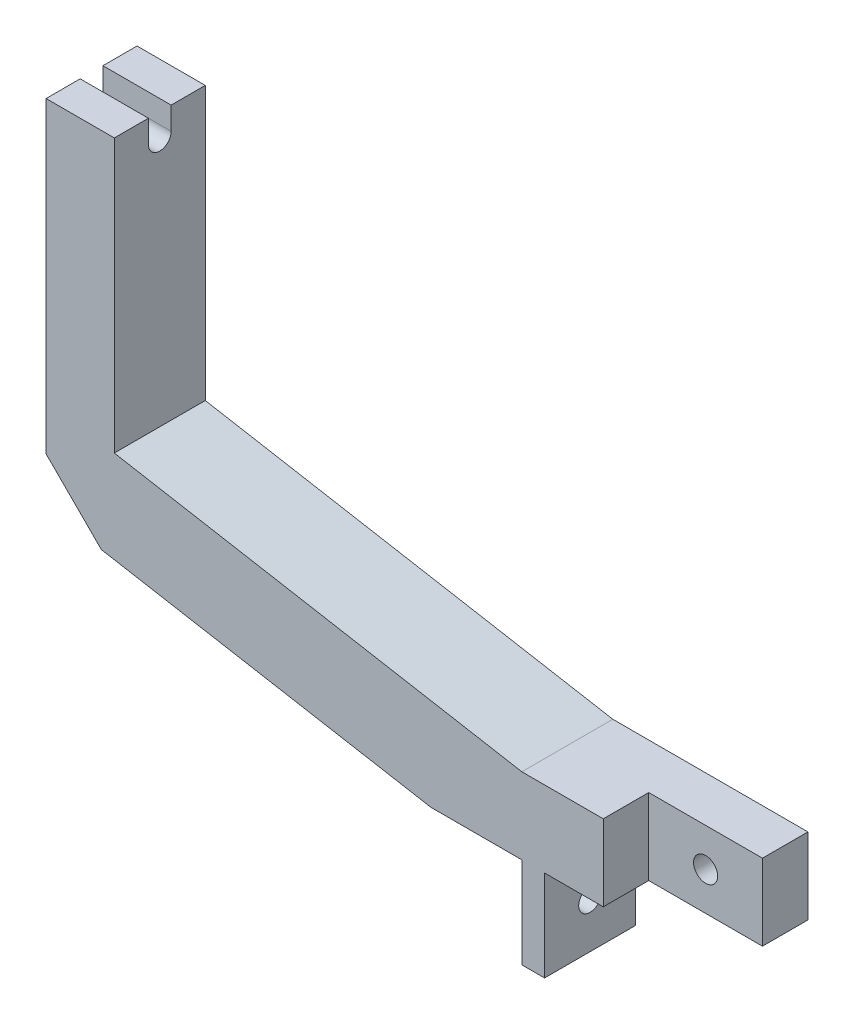
ISO-10303-21;
HEADER;
FILE_DESCRIPTION(('STEP AP214'),'2;1');
FILE_NAME('part.step','',(''),(''),'','','');
FILE_SCHEMA(('AUTOMOTIVE_DESIGN { 1 0 10303 214 1 1 1 1 }'));
ENDSEC;
DATA;
#1=APPLICATION_CONTEXT('core data for automotive mechanical design processes');
#2=APPLICATION_PROTOCOL_DEFINITION('international standard','automotive_design',2000,#1);
#3=PRODUCT_CONTEXT('',#1,'mechanical');
#4=PRODUCT('Part','Part','',(#3));
#5=PRODUCT_RELATED_PRODUCT_CATEGORY('part','',(#4));
#6=PRODUCT_DEFINITION_FORMATION('','',#4);
#7=PRODUCT_DEFINITION_CONTEXT('part definition',#1,'design');
#8=PRODUCT_DEFINITION('design','',#6,#7);
#9=PRODUCT_DEFINITION_SHAPE('','',#8);
#10=(LENGTH_UNIT() NAMED_UNIT(*) SI_UNIT(.MILLI.,.METRE.));
#11=(NAMED_UNIT(*) PLANE_ANGLE_UNIT() SI_UNIT($,.RADIAN.));
#12=(NAMED_UNIT(*) SI_UNIT($,.STERADIAN.) SOLID_ANGLE_UNIT());
#13=UNCERTAINTY_MEASURE_WITH_UNIT(LENGTH_MEASURE(1.E-05),#10,'distance_accuracy_value','');
#14=(GEOMETRIC_REPRESENTATION_CONTEXT(3) GLOBAL_UNCERTAINTY_ASSIGNED_CONTEXT((#13)) GLOBAL_UNIT_ASSIGNED_CONTEXT((#10,
#11,#12)) REPRESENTATION_CONTEXT('',''));
#15=CARTESIAN_POINT('',(0.,0.,0.));
#16=DIRECTION('',(0.,0.,1.));
#17=DIRECTION('',(1.,0.,0.));
#18=AXIS2_PLACEMENT_3D('',#15,#16,#17);
#19=CARTESIAN_POINT('',(-171.45,117.668501524975,25.4));
#20=DIRECTION('',(0.,-1.,0.));
#21=DIRECTION('',(0.,0.,-1.));
#22=AXIS2_PLACEMENT_3D('',#19,#20,#21);
#23=PLANE('',#22);
#24=DIRECTION('',(1.,0.,0.));
#25=VECTOR('',#24,1.);
#26=CARTESIAN_POINT('',(-171.45,117.668501524975,15.875));
#27=LINE('',#26,#25);
#28=CARTESIAN_POINT('',(-171.45,117.668501524975,15.875));
#29=VERTEX_POINT('',#28);
#30=CARTESIAN_POINT('',(-152.4,117.668501524975,15.875));
#31=VERTEX_POINT('',#30);
#32=EDGE_CURVE('E243',#29,#31,#27,.T.);
#33=ORIENTED_EDGE('',*,*,#32,.F.);
#34=DIRECTION('',(0.,0.,-1.));
#35=VECTOR('',#34,1.);
#36=CARTESIAN_POINT('',(-171.45,117.668501524975,25.4));
#37=LINE('',#36,#35);
#38=CARTESIAN_POINT('',(-171.45,117.668501524975,25.4));
#39=VERTEX_POINT('',#38);
#40=EDGE_CURVE('E346',#39,#29,#37,.T.);
#41=ORIENTED_EDGE('',*,*,#40,.F.);
#42=DIRECTION('',(-1.,0.,0.));
#43=VECTOR('',#42,1.);
#44=CARTESIAN_POINT('',(-171.45,117.668501524975,25.4));
#45=LINE('',#44,#43);
#46=CARTESIAN_POINT('',(-152.4,117.668501524975,25.4));
#47=VERTEX_POINT('',#46);
#48=EDGE_CURVE('E287',#47,#39,#45,.T.);
#49=ORIENTED_EDGE('',*,*,#48,.F.);
#50=DIRECTION('',(0.,0.,-1.));
#51=VECTOR('',#50,1.);
#52=CARTESIAN_POINT('',(-152.4,117.668501524975,25.4));
#53=LINE('',#52,#51);
#54=EDGE_CURVE('E355',#47,#31,#53,.T.);
#55=ORIENTED_EDGE('',*,*,#54,.T.);
#56=EDGE_LOOP('',(#33,#41,#49,#55));
#57=FACE_BOUND('',#56,.T.);
#58=ADVANCED_FACE('F50',(#57),#23,.F.);
#59=CARTESIAN_POINT('',(-152.4,117.668501524975,25.4));
#60=DIRECTION('',(-1.,0.,0.));
#61=DIRECTION('',(0.,0.,1.));
#62=AXIS2_PLACEMENT_3D('',#59,#60,#61);
#63=PLANE('',#62);
#64=DIRECTION('',(0.,1.,0.));
#65=VECTOR('',#64,1.);
#66=CARTESIAN_POINT('',(-152.4,117.668501524975,9.525));
#67=LINE('',#66,#65);
#68=CARTESIAN_POINT('',(-152.4,111.318501524975,9.525));
#69=VERTEX_POINT('',#68);
#70=CARTESIAN_POINT('',(-152.4,117.668501524975,9.525));
#71=VERTEX_POINT('',#70);
#72=EDGE_CURVE('E265',#69,#71,#67,.T.);
#73=ORIENTED_EDGE('',*,*,#72,.F.);
#74=CARTESIAN_POINT('',(-152.4,111.318501524975,12.7));
#75=DIRECTION('',(-1.,0.,0.));
#76=DIRECTION('',(0.,0.,1.));
#77=AXIS2_PLACEMENT_3D('',#74,#75,#76);
#78=CIRCLE('',#77,3.175);
#79=CARTESIAN_POINT('',(-152.4,111.318501524975,15.875));
#80=VERTEX_POINT('',#79);
#81=EDGE_CURVE('E259',#80,#69,#78,.F.);
#82=ORIENTED_EDGE('',*,*,#81,.F.);
#83=DIRECTION('',(0.,1.,0.));
#84=VECTOR('',#83,1.);
#85=CARTESIAN_POINT('',(-152.4,117.668501524975,15.875));
#86=LINE('',#85,#84);
#87=EDGE_CURVE('E240',#80,#31,#86,.T.);
#88=ORIENTED_EDGE('',*,*,#87,.T.);
#89=ORIENTED_EDGE('',*,*,#54,.F.);
#90=DIRECTION('',(0.,1.,0.));
#91=VECTOR('',#90,1.);
#92=CARTESIAN_POINT('',(-152.4,117.668501524975,25.4));
#93=LINE('',#92,#91);
#94=CARTESIAN_POINT('',(-152.4,41.4685015249753,25.4));
#95=VERTEX_POINT('',#94);
#96=EDGE_CURVE('E283',#95,#47,#93,.T.);
#97=ORIENTED_EDGE('',*,*,#96,.F.);
#98=DIRECTION('',(0.,0.,-1.));
#99=VECTOR('',#98,1.);
#100=CARTESIAN_POINT('',(-152.4,41.4685015249753,25.4));
#101=LINE('',#100,#99);
#102=CARTESIAN_POINT('',(-152.4,41.4685015249753,0.));
#103=VERTEX_POINT('',#102);
#104=EDGE_CURVE('E357',#95,#103,#101,.T.);
#105=ORIENTED_EDGE('',*,*,#104,.T.);
#106=DIRECTION('',(0.,1.,0.));
#107=VECTOR('',#106,1.);
#108=CARTESIAN_POINT('',(-152.4,117.668501524975,0.));
#109=LINE('',#108,#107);
#110=CARTESIAN_POINT('',(-152.4,117.668501524975,0.));
#111=VERTEX_POINT('',#110);
#112=EDGE_CURVE('E320',#103,#111,#109,.T.);
#113=ORIENTED_EDGE('',*,*,#112,.T.);
#114=EDGE_CURVE('E351',#71,#111,#53,.T.);
#115=ORIENTED_EDGE('',*,*,#114,.F.);
#116=EDGE_LOOP('',(#73,#82,#88,#89,#97,#105,#113,#115));
#117=FACE_BOUND('',#116,.T.);
#118=ADVANCED_FACE('F412',(#117),#63,.F.);
#119=CARTESIAN_POINT('',(-171.45,19.05,25.4));
#120=DIRECTION('',(1.,0.,0.));
#121=DIRECTION('',(0.,1.,0.));
#122=AXIS2_PLACEMENT_3D('',#119,#120,#121);
#123=PLANE('',#122);
#124=DIRECTION('',(0.,-1.,0.));
#125=VECTOR('',#124,1.);
#126=CARTESIAN_POINT('',(-171.45,19.05,0.));
#127=LINE('',#126,#125);
#128=CARTESIAN_POINT('',(-171.45,117.668501524975,0.));
#129=VERTEX_POINT('',#128);
#130=CARTESIAN_POINT('',(-171.45,31.7500000000001,0.));
#131=VERTEX_POINT('',#130);
#132=EDGE_CURVE('E324',#129,#131,#127,.T.);
#133=ORIENTED_EDGE('',*,*,#132,.T.);
#134=DIRECTION('',(0.,0.,1.));
#135=VECTOR('',#134,1.);
#136=CARTESIAN_POINT('',(-171.45,31.7500000000001,25.4));
#137=LINE('',#136,#135);
#138=CARTESIAN_POINT('',(-171.45,31.7500000000001,25.4));
#139=VERTEX_POINT('',#138);
#140=EDGE_CURVE('E71',#131,#139,#137,.T.);
#141=ORIENTED_EDGE('',*,*,#140,.T.);
#142=DIRECTION('',(0.,-1.,0.));
#143=VECTOR('',#142,1.);
#144=CARTESIAN_POINT('',(-171.45,19.05,25.4));
#145=LINE('',#144,#143);
#146=EDGE_CURVE('E290',#39,#139,#145,.T.);
#147=ORIENTED_EDGE('',*,*,#146,.F.);
#148=ORIENTED_EDGE('',*,*,#40,.T.);
#149=DIRECTION('',(0.,-1.,0.));
#150=VECTOR('',#149,1.);
#151=CARTESIAN_POINT('',(-171.45,117.668501524975,15.875));
#152=LINE('',#151,#150);
#153=CARTESIAN_POINT('',(-171.45,111.318501524975,15.875));
#154=VERTEX_POINT('',#153);
#155=EDGE_CURVE('E230',#29,#154,#152,.T.);
#156=ORIENTED_EDGE('',*,*,#155,.T.);
#157=CARTESIAN_POINT('',(-171.45,111.318501524975,12.7));
#158=DIRECTION('',(-1.,0.,0.));
#159=DIRECTION('',(0.,-1.,0.));
#160=AXIS2_PLACEMENT_3D('',#157,#158,#159);
#161=CIRCLE('',#160,3.175);
#162=CARTESIAN_POINT('',(-171.45,111.318501524975,9.525));
#163=VERTEX_POINT('',#162);
#164=EDGE_CURVE('E223',#163,#154,#161,.T.);
#165=ORIENTED_EDGE('',*,*,#164,.F.);
#166=DIRECTION('',(0.,-1.,0.));
#167=VECTOR('',#166,1.);
#168=CARTESIAN_POINT('',(-171.45,117.668501524975,9.525));
#169=LINE('',#168,#167);
#170=CARTESIAN_POINT('',(-171.45,117.668501524975,9.525));
#171=VERTEX_POINT('',#170);
#172=EDGE_CURVE('E222',#171,#163,#169,.T.);
#173=ORIENTED_EDGE('',*,*,#172,.F.);
#174=EDGE_CURVE('E350',#171,#129,#37,.T.);
#175=ORIENTED_EDGE('',*,*,#174,.T.);
#176=EDGE_LOOP('',(#133,#141,#147,#148,#156,#165,#173,#175));
#177=FACE_BOUND('',#176,.T.);
#178=ADVANCED_FACE('F418',(#177),#123,.F.);
#179=CARTESIAN_POINT('',(-32.258,-25.4,25.4));
#180=DIRECTION('',(0.,1.,0.));
#181=DIRECTION('',(0.,0.,1.));
#182=AXIS2_PLACEMENT_3D('',#179,#180,#181);
#183=PLANE('',#182);
#184=DIRECTION('',(1.,0.,0.));
#185=VECTOR('',#184,1.);
#186=CARTESIAN_POINT('',(-32.258,-25.4,0.));
#187=LINE('',#186,#185);
#188=CARTESIAN_POINT('',(-38.608,-25.4,0.));
#189=VERTEX_POINT('',#188);
#190=CARTESIAN_POINT('',(-32.258,-25.4,0.));
#191=VERTEX_POINT('',#190);
#192=EDGE_CURVE('E264',#189,#191,#187,.T.);
#193=ORIENTED_EDGE('',*,*,#192,.T.);
#194=DIRECTION('',(0.,0.,-1.));
#195=VECTOR('',#194,1.);
#196=CARTESIAN_POINT('',(-32.258,-25.4,25.4));
#197=LINE('',#196,#195);
#198=CARTESIAN_POINT('',(-32.258,-25.4,25.4));
#199=VERTEX_POINT('',#198);
#200=EDGE_CURVE('E366',#199,#191,#197,.T.);
#201=ORIENTED_EDGE('',*,*,#200,.F.);
#202=DIRECTION('',(1.,0.,0.));
#203=VECTOR('',#202,1.);
#204=CARTESIAN_POINT('',(-32.258,-25.4,25.4));
#205=LINE('',#204,#203);
#206=CARTESIAN_POINT('',(-38.608,-25.4,25.4));
#207=VERTEX_POINT('',#206);
#208=EDGE_CURVE('E266',#207,#199,#205,.T.);
#209=ORIENTED_EDGE('',*,*,#208,.F.);
#210=DIRECTION('',(0.,0.,-1.));
#211=VECTOR('',#210,1.);
#212=CARTESIAN_POINT('',(-38.608,-25.4,25.4));
#213=LINE('',#212,#211);
#214=EDGE_CURVE('E302',#207,#189,#213,.T.);
#215=ORIENTED_EDGE('',*,*,#214,.T.);
#216=EDGE_LOOP('',(#193,#201,#209,#215));
#217=FACE_BOUND('',#216,.T.);
#218=ADVANCED_FACE('F444',(#217),#183,.F.);
#219=CARTESIAN_POINT('',(-32.258,0.,25.4));
#220=DIRECTION('',(-1.,0.,0.));
#221=DIRECTION('',(0.,0.,1.));
#222=AXIS2_PLACEMENT_3D('',#219,#220,#221);
#223=PLANE('',#222);
#224=CARTESIAN_POINT('',(-32.258,-12.7,12.7));
#225=DIRECTION('',(-1.,0.,0.));
#226=DIRECTION('',(0.,0.,1.));
#227=AXIS2_PLACEMENT_3D('',#224,#225,#226);
#228=CIRCLE('',#227,3.175);
#229=CARTESIAN_POINT('',(-32.258,-12.7,15.875));
#230=VERTEX_POINT('',#229);
#231=EDGE_CURVE('E220',#230,#230,#228,.T.);
#232=ORIENTED_EDGE('',*,*,#231,.T.);
#233=EDGE_LOOP('',(#232));
#234=FACE_BOUND('',#233,.T.);
#235=DIRECTION('',(0.,1.,0.));
#236=VECTOR('',#235,1.);
#237=CARTESIAN_POINT('',(-32.258,0.,0.));
#238=LINE('',#237,#236);
#239=CARTESIAN_POINT('',(-32.258,0.,0.));
#240=VERTEX_POINT('',#239);
#241=EDGE_CURVE('E308',#191,#240,#238,.T.);
#242=ORIENTED_EDGE('',*,*,#241,.T.);
#243=DIRECTION('',(0.,0.,-1.));
#244=VECTOR('',#243,1.);
#245=CARTESIAN_POINT('',(-32.258,0.,25.4));
#246=LINE('',#245,#244);
#247=CARTESIAN_POINT('',(-32.258,0.,25.4));
#248=VERTEX_POINT('',#247);
#249=EDGE_CURVE('E364',#248,#240,#246,.T.);
#250=ORIENTED_EDGE('',*,*,#249,.F.);
#251=DIRECTION('',(0.,1.,0.));
#252=VECTOR('',#251,1.);
#253=CARTESIAN_POINT('',(-32.258,0.,25.4));
#254=LINE('',#253,#252);
#255=EDGE_CURVE('E269',#199,#248,#254,.T.);
#256=ORIENTED_EDGE('',*,*,#255,.F.);
#257=ORIENTED_EDGE('',*,*,#200,.T.);
#258=EDGE_LOOP('',(#242,#250,#256,#257));
#259=FACE_BOUND('',#258,.T.);
#260=ADVANCED_FACE('F443',(#234,#259),#223,.F.);
#261=CARTESIAN_POINT('',(32.258,0.,25.4));
#262=DIRECTION('',(0.,1.,0.));
#263=DIRECTION('',(0.,0.,1.));
#264=AXIS2_PLACEMENT_3D('',#261,#262,#263);
#265=PLANE('',#264);
#266=DIRECTION('',(-1.,0.,0.));
#267=VECTOR('',#266,1.);
#268=CARTESIAN_POINT('',(32.258,0.,12.7));
#269=LINE('',#268,#267);
#270=CARTESIAN_POINT('',(15.875,0.,12.7));
#271=VERTEX_POINT('',#270);
#272=CARTESIAN_POINT('',(-15.875,0.,12.7));
#273=VERTEX_POINT('',#272);
#274=EDGE_CURVE('E183',#271,#273,#269,.T.);
#275=ORIENTED_EDGE('',*,*,#274,.T.);
#276=DIRECTION('',(0.,0.,1.));
#277=VECTOR('',#276,1.);
#278=CARTESIAN_POINT('',(-15.875,0.,25.4));
#279=LINE('',#278,#277);
#280=CARTESIAN_POINT('',(-15.875,0.,25.4));
#281=VERTEX_POINT('',#280);
#282=EDGE_CURVE('E193',#273,#281,#279,.T.);
#283=ORIENTED_EDGE('',*,*,#282,.T.);
#284=DIRECTION('',(1.,0.,0.));
#285=VECTOR('',#284,1.);
#286=CARTESIAN_POINT('',(32.258,0.,25.4));
#287=LINE('',#286,#285);
#288=EDGE_CURVE('E273',#248,#281,#287,.T.);
#289=ORIENTED_EDGE('',*,*,#288,.F.);
#290=ORIENTED_EDGE('',*,*,#249,.T.);
#291=DIRECTION('',(1.,0.,0.));
#292=VECTOR('',#291,1.);
#293=CARTESIAN_POINT('',(32.258,0.,0.));
#294=LINE('',#293,#292);
#295=CARTESIAN_POINT('',(15.875,0.,0.));
#296=VERTEX_POINT('',#295);
#297=EDGE_CURVE('E202',#240,#296,#294,.T.);
#298=ORIENTED_EDGE('',*,*,#297,.T.);
#299=DIRECTION('',(0.,0.,1.));
#300=VECTOR('',#299,1.);
#301=CARTESIAN_POINT('',(15.875,0.,25.4));
#302=LINE('',#301,#300);
#303=EDGE_CURVE('E62',#296,#271,#302,.T.);
#304=ORIENTED_EDGE('',*,*,#303,.T.);
#305=EDGE_LOOP('',(#275,#283,#289,#290,#298,#304));
#306=FACE_BOUND('',#305,.T.);
#307=ADVANCED_FACE('F205',(#306),#265,.F.);
#308=CARTESIAN_POINT('',(-38.608,21.2926150001526,25.4));
#309=DIRECTION('',(0.,-1.,0.));
#310=DIRECTION('',(0.,0.,-1.));
#311=AXIS2_PLACEMENT_3D('',#308,#309,#310);
#312=PLANE('',#311);
#313=DIRECTION('',(-1.,0.,0.));
#314=VECTOR('',#313,1.);
#315=CARTESIAN_POINT('',(-38.608,21.2926150001526,25.4));
#316=LINE('',#315,#314);
#317=CARTESIAN_POINT('',(-15.875,21.2926150001526,25.4));
#318=VERTEX_POINT('',#317);
#319=CARTESIAN_POINT('',(-38.608,21.2926150001526,25.4));
#320=VERTEX_POINT('',#319);
#321=EDGE_CURVE('E279',#318,#320,#316,.T.);
#322=ORIENTED_EDGE('',*,*,#321,.F.);
#323=DIRECTION('',(0.,0.,-1.));
#324=VECTOR('',#323,1.);
#325=CARTESIAN_POINT('',(-15.875,21.2926150001526,25.4));
#326=LINE('',#325,#324);
#327=CARTESIAN_POINT('',(-15.875,21.2926150001526,12.7));
#328=VERTEX_POINT('',#327);
#329=EDGE_CURVE('E210',#318,#328,#326,.T.);
#330=ORIENTED_EDGE('',*,*,#329,.T.);
#331=DIRECTION('',(1.,0.,0.));
#332=VECTOR('',#331,1.);
#333=CARTESIAN_POINT('',(-38.608,21.2926150001526,12.7));
#334=LINE('',#333,#332);
#335=CARTESIAN_POINT('',(15.875,21.2926150001526,12.7));
#336=VERTEX_POINT('',#335);
#337=EDGE_CURVE('E11',#328,#336,#334,.T.);
#338=ORIENTED_EDGE('',*,*,#337,.T.);
#339=DIRECTION('',(0.,0.,-1.));
#340=VECTOR('',#339,1.);
#341=CARTESIAN_POINT('',(15.875,21.2926150001526,25.4));
#342=LINE('',#341,#340);
#343=CARTESIAN_POINT('',(15.875,21.2926150001526,0.));
#344=VERTEX_POINT('',#343);
#345=EDGE_CURVE('E196',#336,#344,#342,.T.);
#346=ORIENTED_EDGE('',*,*,#345,.T.);
#347=DIRECTION('',(-1.,0.,0.));
#348=VECTOR('',#347,1.);
#349=CARTESIAN_POINT('',(-38.608,21.2926150001526,0.));
#350=LINE('',#349,#348);
#351=CARTESIAN_POINT('',(-38.608,21.2926150001526,0.));
#352=VERTEX_POINT('',#351);
#353=EDGE_CURVE('E313',#344,#352,#350,.T.);
#354=ORIENTED_EDGE('',*,*,#353,.T.);
#355=DIRECTION('',(0.,0.,-1.));
#356=VECTOR('',#355,1.);
#357=CARTESIAN_POINT('',(-38.608,21.2926150001526,25.4));
#358=LINE('',#357,#356);
#359=EDGE_CURVE('E363',#320,#352,#358,.T.);
#360=ORIENTED_EDGE('',*,*,#359,.F.);
#361=EDGE_LOOP('',(#322,#330,#338,#346,#354,#360));
#362=FACE_BOUND('',#361,.T.);
#363=ADVANCED_FACE('F398',(#362),#312,.F.);
#364=CARTESIAN_POINT('',(-152.4,41.4685015249753,25.4));
#365=DIRECTION('',(-0.17458202722218,-0.984642633533098,0.));
#366=DIRECTION('',(0.984642633533098,-0.17458202722218,0.));
#367=AXIS2_PLACEMENT_3D('',#364,#365,#366);
#368=PLANE('',#367);
#369=DIRECTION('',(-0.984642633533098,0.17458202722218,0.));
#370=VECTOR('',#369,1.);
#371=CARTESIAN_POINT('',(-152.4,41.4685015249753,0.));
#372=LINE('',#371,#370);
#373=EDGE_CURVE('E314',#352,#103,#372,.T.);
#374=ORIENTED_EDGE('',*,*,#373,.T.);
#375=ORIENTED_EDGE('',*,*,#104,.F.);
#376=DIRECTION('',(-0.984642633533098,0.17458202722218,0.));
#377=VECTOR('',#376,1.);
#378=CARTESIAN_POINT('',(-152.4,41.4685015249753,25.4));
#379=LINE('',#378,#377);
#380=EDGE_CURVE('E284',#320,#95,#379,.T.);
#381=ORIENTED_EDGE('',*,*,#380,.F.);
#382=ORIENTED_EDGE('',*,*,#359,.T.);
#383=EDGE_LOOP('',(#374,#375,#381,#382));
#384=FACE_BOUND('',#383,.T.);
#385=ADVANCED_FACE('F403',(#384),#368,.F.);
#386=ORIENTED_EDGE('',*,*,#174,.F.);
#387=DIRECTION('',(1.,0.,0.));
#388=VECTOR('',#387,1.);
#389=CARTESIAN_POINT('',(-171.45,117.668501524975,9.525));
#390=LINE('',#389,#388);
#391=EDGE_CURVE('E232',#171,#71,#390,.T.);
#392=ORIENTED_EDGE('',*,*,#391,.T.);
#393=ORIENTED_EDGE('',*,*,#114,.T.);
#394=DIRECTION('',(-1.,0.,0.));
#395=VECTOR('',#394,1.);
#396=CARTESIAN_POINT('',(-171.45,117.668501524975,0.));
#397=LINE('',#396,#395);
#398=EDGE_CURVE('E321',#111,#129,#397,.T.);
#399=ORIENTED_EDGE('',*,*,#398,.T.);
#400=EDGE_LOOP('',(#386,#392,#393,#399));
#401=FACE_BOUND('',#400,.T.);
#402=ADVANCED_FACE('F472',(#401),#23,.F.);
#403=CARTESIAN_POINT('',(-64.008,0.,25.4));
#404=DIRECTION('',(0.17458202722218,0.984642633533098,0.));
#405=DIRECTION('',(-0.984642633533098,0.17458202722218,0.));
#406=AXIS2_PLACEMENT_3D('',#403,#404,#405);
#407=PLANE('',#406);
#408=DIRECTION('',(0.984642633533098,-0.17458202722218,0.));
#409=VECTOR('',#408,1.);
#410=CARTESIAN_POINT('',(-64.008,0.,25.4));
#411=LINE('',#410,#409);
#412=CARTESIAN_POINT('',(-156.012931034483,16.3129310344827,25.4));
#413=VERTEX_POINT('',#412);
#414=CARTESIAN_POINT('',(-64.008,0.,25.4));
#415=VERTEX_POINT('',#414);
#416=EDGE_CURVE('E291',#413,#415,#411,.T.);
#417=ORIENTED_EDGE('',*,*,#416,.F.);
#418=DIRECTION('',(0.,0.,-1.));
#419=VECTOR('',#418,1.);
#420=CARTESIAN_POINT('',(-156.012931034483,16.3129310344827,25.4));
#421=LINE('',#420,#419);
#422=CARTESIAN_POINT('',(-156.012931034483,16.3129310344827,0.));
#423=VERTEX_POINT('',#422);
#424=EDGE_CURVE('E375',#413,#423,#421,.T.);
#425=ORIENTED_EDGE('',*,*,#424,.T.);
#426=DIRECTION('',(0.984642633533098,-0.17458202722218,0.));
#427=VECTOR('',#426,1.);
#428=CARTESIAN_POINT('',(-64.008,0.,0.));
#429=LINE('',#428,#427);
#430=CARTESIAN_POINT('',(-64.008,0.,0.));
#431=VERTEX_POINT('',#430);
#432=EDGE_CURVE('E327',#423,#431,#429,.T.);
#433=ORIENTED_EDGE('',*,*,#432,.T.);
#434=DIRECTION('',(0.,0.,-1.));
#435=VECTOR('',#434,1.);
#436=CARTESIAN_POINT('',(-64.008,0.,25.4));
#437=LINE('',#436,#435);
#438=EDGE_CURVE('E344',#415,#431,#437,.T.);
#439=ORIENTED_EDGE('',*,*,#438,.F.);
#440=EDGE_LOOP('',(#417,#425,#433,#439));
#441=FACE_BOUND('',#440,.T.);
#442=ADVANCED_FACE('F421',(#441),#407,.F.);
#443=CARTESIAN_POINT('',(-38.608,0.,25.4));
#444=DIRECTION('',(0.,1.,0.));
#445=DIRECTION('',(-1.,0.,0.));
#446=AXIS2_PLACEMENT_3D('',#443,#444,#445);
#447=PLANE('',#446);
#448=DIRECTION('',(1.,0.,0.));
#449=VECTOR('',#448,1.);
#450=CARTESIAN_POINT('',(-38.608,0.,0.));
#451=LINE('',#450,#449);
#452=CARTESIAN_POINT('',(-38.608,0.,0.));
#453=VERTEX_POINT('',#452);
#454=EDGE_CURVE('E332',#431,#453,#451,.T.);
#455=ORIENTED_EDGE('',*,*,#454,.T.);
#456=DIRECTION('',(0.,0.,-1.));
#457=VECTOR('',#456,1.);
#458=CARTESIAN_POINT('',(-38.608,0.,25.4));
#459=LINE('',#458,#457);
#460=CARTESIAN_POINT('',(-38.608,0.,25.4));
#461=VERTEX_POINT('',#460);
#462=EDGE_CURVE('E338',#461,#453,#459,.T.);
#463=ORIENTED_EDGE('',*,*,#462,.F.);
#464=DIRECTION('',(1.,0.,0.));
#465=VECTOR('',#464,1.);
#466=CARTESIAN_POINT('',(-38.608,0.,25.4));
#467=LINE('',#466,#465);
#468=EDGE_CURVE('E299',#415,#461,#467,.T.);
#469=ORIENTED_EDGE('',*,*,#468,.F.);
#470=ORIENTED_EDGE('',*,*,#438,.T.);
#471=EDGE_LOOP('',(#455,#463,#469,#470));
#472=FACE_BOUND('',#471,.T.);
#473=ADVANCED_FACE('F433',(#472),#447,.F.);
#474=CARTESIAN_POINT('',(-38.608,-25.4,25.4));
#475=DIRECTION('',(1.,0.,0.));
#476=DIRECTION('',(0.,0.,-1.));
#477=AXIS2_PLACEMENT_3D('',#474,#475,#476);
#478=PLANE('',#477);
#479=CARTESIAN_POINT('',(-38.608,-12.7,12.7));
#480=DIRECTION('',(1.,0.,0.));
#481=DIRECTION('',(0.,0.,-1.));
#482=AXIS2_PLACEMENT_3D('',#479,#480,#481);
#483=CIRCLE('',#482,3.175);
#484=CARTESIAN_POINT('',(-38.608,-12.7,9.525));
#485=VERTEX_POINT('',#484);
#486=EDGE_CURVE('E194',#485,#485,#483,.T.);
#487=ORIENTED_EDGE('',*,*,#486,.T.);
#488=EDGE_LOOP('',(#487));
#489=FACE_BOUND('',#488,.T.);
#490=DIRECTION('',(0.,-1.,0.));
#491=VECTOR('',#490,1.);
#492=CARTESIAN_POINT('',(-38.608,-25.4,0.));
#493=LINE('',#492,#491);
#494=EDGE_CURVE('E271',#453,#189,#493,.T.);
#495=ORIENTED_EDGE('',*,*,#494,.T.);
#496=ORIENTED_EDGE('',*,*,#214,.F.);
#497=DIRECTION('',(0.,-1.,0.));
#498=VECTOR('',#497,1.);
#499=CARTESIAN_POINT('',(-38.608,-25.4,25.4));
#500=LINE('',#499,#498);
#501=EDGE_CURVE('E298',#461,#207,#500,.T.);
#502=ORIENTED_EDGE('',*,*,#501,.F.);
#503=ORIENTED_EDGE('',*,*,#462,.T.);
#504=EDGE_LOOP('',(#495,#496,#502,#503));
#505=FACE_BOUND('',#504,.T.);
#506=ADVANCED_FACE('F440',(#489,#505),#478,.F.);
#507=CARTESIAN_POINT('',(0.,0.,25.4));
#508=DIRECTION('',(0.,0.,-1.));
#509=DIRECTION('',(-1.,0.,0.));
#510=AXIS2_PLACEMENT_3D('',#507,#508,#509);
#511=PLANE('',#510);
#512=ORIENTED_EDGE('',*,*,#288,.T.);
#513=DIRECTION('',(0.,1.,0.));
#514=VECTOR('',#513,1.);
#515=CARTESIAN_POINT('',(-15.875,0.,25.4));
#516=LINE('',#515,#514);
#517=EDGE_CURVE('E59',#281,#318,#516,.T.);
#518=ORIENTED_EDGE('',*,*,#517,.T.);
#519=ORIENTED_EDGE('',*,*,#321,.T.);
#520=ORIENTED_EDGE('',*,*,#380,.T.);
#521=ORIENTED_EDGE('',*,*,#96,.T.);
#522=ORIENTED_EDGE('',*,*,#48,.T.);
#523=ORIENTED_EDGE('',*,*,#146,.T.);
#524=DIRECTION('',(-0.707106781186546,0.707106781186549,0.));
#525=VECTOR('',#524,1.);
#526=CARTESIAN_POINT('',(-156.012931034483,16.3129310344827,25.4));
#527=LINE('',#526,#525);
#528=EDGE_CURVE('E383',#139,#413,#527,.F.);
#529=ORIENTED_EDGE('',*,*,#528,.T.);
#530=ORIENTED_EDGE('',*,*,#416,.T.);
#531=ORIENTED_EDGE('',*,*,#468,.T.);
#532=ORIENTED_EDGE('',*,*,#501,.T.);
#533=ORIENTED_EDGE('',*,*,#208,.T.);
#534=ORIENTED_EDGE('',*,*,#255,.T.);
#535=EDGE_LOOP('',(#512,#518,#519,#520,#521,#522,#523,#529,#530,#531,#532,#533,#534));
#536=FACE_BOUND('',#535,.T.);
#537=ADVANCED_FACE('F393',(#536),#511,.F.);
#538=CARTESIAN_POINT('',(0.,0.,0.));
#539=DIRECTION('',(0.,0.,-1.));
#540=DIRECTION('',(-1.,0.,0.));
#541=AXIS2_PLACEMENT_3D('',#538,#539,#540);
#542=PLANE('',#541);
#543=CARTESIAN_POINT('',(0.,10.6463075000763,0.));
#544=DIRECTION('',(0.,0.,1.));
#545=DIRECTION('',(1.,0.,0.));
#546=AXIS2_PLACEMENT_3D('',#543,#544,#545);
#547=CIRCLE('',#546,3.3655);
#548=CARTESIAN_POINT('',(3.3655,10.6463075000763,0.));
#549=VERTEX_POINT('',#548);
#550=EDGE_CURVE('E447',#549,#549,#547,.T.);
#551=ORIENTED_EDGE('',*,*,#550,.T.);
#552=EDGE_LOOP('',(#551));
#553=FACE_BOUND('',#552,.T.);
#554=DIRECTION('',(0.,1.,0.));
#555=VECTOR('',#554,1.);
#556=CARTESIAN_POINT('',(15.875,0.,0.));
#557=LINE('',#556,#555);
#558=EDGE_CURVE('E390',#296,#344,#557,.T.);
#559=ORIENTED_EDGE('',*,*,#558,.F.);
#560=ORIENTED_EDGE('',*,*,#297,.F.);
#561=ORIENTED_EDGE('',*,*,#241,.F.);
#562=ORIENTED_EDGE('',*,*,#192,.F.);
#563=ORIENTED_EDGE('',*,*,#494,.F.);
#564=ORIENTED_EDGE('',*,*,#454,.F.);
#565=ORIENTED_EDGE('',*,*,#432,.F.);
#566=DIRECTION('',(0.707106781186546,-0.707106781186549,0.));
#567=VECTOR('',#566,1.);
#568=CARTESIAN_POINT('',(-69.8500000000003,-69.85,0.));
#569=LINE('',#568,#567);
#570=EDGE_CURVE('E377',#423,#131,#569,.F.);
#571=ORIENTED_EDGE('',*,*,#570,.T.);
#572=ORIENTED_EDGE('',*,*,#132,.F.);
#573=ORIENTED_EDGE('',*,*,#398,.F.);
#574=ORIENTED_EDGE('',*,*,#112,.F.);
#575=ORIENTED_EDGE('',*,*,#373,.F.);
#576=ORIENTED_EDGE('',*,*,#353,.F.);
#577=EDGE_LOOP('',(#559,#560,#561,#562,#563,#564,#565,#571,#572,#573,#574,#575,#576));
#578=FACE_BOUND('',#577,.T.);
#579=ADVANCED_FACE('F430',(#553,#578),#542,.T.);
#580=CARTESIAN_POINT('',(-171.45,111.318501524975,12.7));
#581=DIRECTION('',(1.,0.,0.));
#582=DIRECTION('',(0.,1.,0.));
#583=AXIS2_PLACEMENT_3D('',#580,#581,#582);
#584=CYLINDRICAL_SURFACE('',#583,3.175);
#585=ORIENTED_EDGE('',*,*,#81,.T.);
#586=DIRECTION('',(1.,0.,0.));
#587=VECTOR('',#586,1.);
#588=CARTESIAN_POINT('',(-171.45,111.318501524975,9.525));
#589=LINE('',#588,#587);
#590=EDGE_CURVE('E234',#163,#69,#589,.T.);
#591=ORIENTED_EDGE('',*,*,#590,.F.);
#592=ORIENTED_EDGE('',*,*,#164,.T.);
#593=DIRECTION('',(1.,0.,0.));
#594=VECTOR('',#593,1.);
#595=CARTESIAN_POINT('',(-171.45,111.318501524975,15.875));
#596=LINE('',#595,#594);
#597=EDGE_CURVE('E236',#154,#80,#596,.T.);
#598=ORIENTED_EDGE('',*,*,#597,.T.);
#599=EDGE_LOOP('',(#585,#591,#592,#598));
#600=FACE_BOUND('',#599,.T.);
#601=ADVANCED_FACE('F496',(#600),#584,.F.);
#602=CARTESIAN_POINT('',(-171.45,117.668501524975,15.875));
#603=DIRECTION('',(0.,0.,1.));
#604=DIRECTION('',(0.,-1.,0.));
#605=AXIS2_PLACEMENT_3D('',#602,#603,#604);
#606=PLANE('',#605);
#607=ORIENTED_EDGE('',*,*,#597,.F.);
#608=ORIENTED_EDGE('',*,*,#155,.F.);
#609=ORIENTED_EDGE('',*,*,#32,.T.);
#610=ORIENTED_EDGE('',*,*,#87,.F.);
#611=EDGE_LOOP('',(#607,#608,#609,#610));
#612=FACE_BOUND('',#611,.T.);
#613=ADVANCED_FACE('F501',(#612),#606,.F.);
#614=CARTESIAN_POINT('',(-171.45,117.668501524975,9.525));
#615=DIRECTION('',(0.,0.,1.));
#616=DIRECTION('',(1.,0.,0.));
#617=AXIS2_PLACEMENT_3D('',#614,#615,#616);
#618=PLANE('',#617);
#619=ORIENTED_EDGE('',*,*,#72,.T.);
#620=ORIENTED_EDGE('',*,*,#391,.F.);
#621=ORIENTED_EDGE('',*,*,#172,.T.);
#622=ORIENTED_EDGE('',*,*,#590,.T.);
#623=EDGE_LOOP('',(#619,#620,#621,#622));
#624=FACE_BOUND('',#623,.T.);
#625=ADVANCED_FACE('F497',(#624),#618,.T.);
#626=CARTESIAN_POINT('',(-171.45,-12.7,12.7));
#627=DIRECTION('',(1.,0.,0.));
#628=DIRECTION('',(0.,0.,-1.));
#629=AXIS2_PLACEMENT_3D('',#626,#627,#628);
#630=CYLINDRICAL_SURFACE('',#629,3.175);
#631=ORIENTED_EDGE('',*,*,#486,.F.);
#632=EDGE_LOOP('',(#631));
#633=FACE_BOUND('',#632,.T.);
#634=ORIENTED_EDGE('',*,*,#231,.F.);
#635=EDGE_LOOP('',(#634));
#636=FACE_BOUND('',#635,.T.);
#637=ADVANCED_FACE('F509',(#633,#636),#630,.F.);
#638=CARTESIAN_POINT('',(-156.012931034483,16.3129310344827,25.4));
#639=DIRECTION('',(0.707106781186549,0.707106781186546,0.));
#640=DIRECTION('',(0.,0.,-1.));
#641=AXIS2_PLACEMENT_3D('',#638,#639,#640);
#642=PLANE('',#641);
#643=ORIENTED_EDGE('',*,*,#528,.F.);
#644=ORIENTED_EDGE('',*,*,#140,.F.);
#645=ORIENTED_EDGE('',*,*,#570,.F.);
#646=ORIENTED_EDGE('',*,*,#424,.F.);
#647=EDGE_LOOP('',(#643,#644,#645,#646));
#648=FACE_BOUND('',#647,.T.);
#649=ADVANCED_FACE('F49',(#648),#642,.F.);
#650=CARTESIAN_POINT('',(15.875,-25.4,12.7));
#651=DIRECTION('',(0.,0.,-1.));
#652=DIRECTION('',(-1.,0.,0.));
#653=AXIS2_PLACEMENT_3D('',#650,#651,#652);
#654=PLANE('',#653);
#655=CARTESIAN_POINT('',(0.,10.6463075000763,12.7));
#656=DIRECTION('',(0.,0.,-1.));
#657=DIRECTION('',(-1.,0.,0.));
#658=AXIS2_PLACEMENT_3D('',#655,#656,#657);
#659=CIRCLE('',#658,3.3655);
#660=CARTESIAN_POINT('',(-3.3655,10.6463075000763,12.7));
#661=VERTEX_POINT('',#660);
#662=EDGE_CURVE('E55',#661,#661,#659,.T.);
#663=ORIENTED_EDGE('',*,*,#662,.T.);
#664=EDGE_LOOP('',(#663));
#665=FACE_BOUND('',#664,.T.);
#666=DIRECTION('',(0.,1.,0.));
#667=VECTOR('',#666,1.);
#668=CARTESIAN_POINT('',(15.875,-25.4,12.7));
#669=LINE('',#668,#667);
#670=EDGE_CURVE('E186',#271,#336,#669,.T.);
#671=ORIENTED_EDGE('',*,*,#670,.T.);
#672=ORIENTED_EDGE('',*,*,#337,.F.);
#673=DIRECTION('',(0.,1.,0.));
#674=VECTOR('',#673,1.);
#675=CARTESIAN_POINT('',(-15.875,-25.4,12.7));
#676=LINE('',#675,#674);
#677=EDGE_CURVE('E188',#273,#328,#676,.T.);
#678=ORIENTED_EDGE('',*,*,#677,.F.);
#679=ORIENTED_EDGE('',*,*,#274,.F.);
#680=EDGE_LOOP('',(#671,#672,#678,#679));
#681=FACE_BOUND('',#680,.T.);
#682=ADVANCED_FACE('F189',(#665,#681),#654,.F.);
#683=CARTESIAN_POINT('',(-15.875,-25.4,12.7));
#684=DIRECTION('',(-1.,0.,0.));
#685=DIRECTION('',(0.,0.,1.));
#686=AXIS2_PLACEMENT_3D('',#683,#684,#685);
#687=PLANE('',#686);
#688=ORIENTED_EDGE('',*,*,#677,.T.);
#689=ORIENTED_EDGE('',*,*,#329,.F.);
#690=ORIENTED_EDGE('',*,*,#517,.F.);
#691=ORIENTED_EDGE('',*,*,#282,.F.);
#692=EDGE_LOOP('',(#688,#689,#690,#691));
#693=FACE_BOUND('',#692,.T.);
#694=ADVANCED_FACE('F449',(#693),#687,.F.);
#695=CARTESIAN_POINT('',(15.875,-25.4,0.));
#696=DIRECTION('',(-1.,0.,0.));
#697=DIRECTION('',(0.,0.,1.));
#698=AXIS2_PLACEMENT_3D('',#695,#696,#697);
#699=PLANE('',#698);
#700=ORIENTED_EDGE('',*,*,#558,.T.);
#701=ORIENTED_EDGE('',*,*,#345,.F.);
#702=ORIENTED_EDGE('',*,*,#670,.F.);
#703=ORIENTED_EDGE('',*,*,#303,.F.);
#704=EDGE_LOOP('',(#700,#701,#702,#703));
#705=FACE_BOUND('',#704,.T.);
#706=ADVANCED_FACE('F198',(#705),#699,.F.);
#707=CARTESIAN_POINT('',(0.,10.6463075000763,0.));
#708=DIRECTION('',(0.,0.,1.));
#709=DIRECTION('',(1.,0.,0.));
#710=AXIS2_PLACEMENT_3D('',#707,#708,#709);
#711=CYLINDRICAL_SURFACE('',#710,3.3655);
#712=ORIENTED_EDGE('',*,*,#550,.F.);
#713=EDGE_LOOP('',(#712));
#714=FACE_BOUND('',#713,.T.);
#715=ORIENTED_EDGE('',*,*,#662,.F.);
#716=EDGE_LOOP('',(#715));
#717=FACE_BOUND('',#716,.T.);
#718=ADVANCED_FACE('F458',(#714,#717),#711,.F.);
#719=CLOSED_SHELL('',(#58,#118,#178,#218,#260,#307,#363,#385,#402,#442,#473,#506,#537,#579,#601,
#613,#625,#637,#649,#682,#694,#706,#718));
#720=MANIFOLD_SOLID_BREP('B2',#719);
#721=ADVANCED_BREP_SHAPE_REPRESENTATION('',(#18,#720),#14);
#722=SHAPE_DEFINITION_REPRESENTATION(#9,#721);
ENDSEC;
END-ISO-10303-21;
